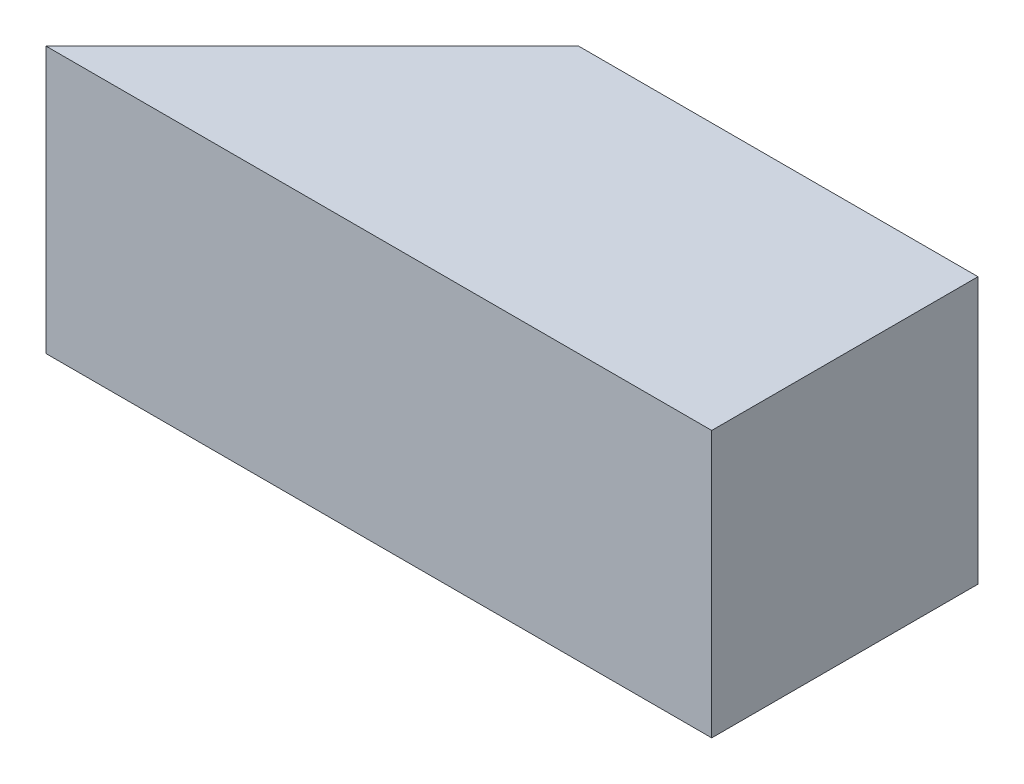
ISO-10303-21;
HEADER;
FILE_DESCRIPTION(('STEP AP214'),'2;1');
FILE_NAME('part.step','',(''),(''),'','','');
FILE_SCHEMA(('AUTOMOTIVE_DESIGN { 1 0 10303 214 1 1 1 1 }'));
ENDSEC;
DATA;
#1=APPLICATION_CONTEXT('core data for automotive mechanical design processes');
#2=APPLICATION_PROTOCOL_DEFINITION('international standard','automotive_design',2000,#1);
#3=PRODUCT_CONTEXT('',#1,'mechanical');
#4=PRODUCT('Part','Part','',(#3));
#5=PRODUCT_RELATED_PRODUCT_CATEGORY('part','',(#4));
#6=PRODUCT_DEFINITION_FORMATION('','',#4);
#7=PRODUCT_DEFINITION_CONTEXT('part definition',#1,'design');
#8=PRODUCT_DEFINITION('design','',#6,#7);
#9=PRODUCT_DEFINITION_SHAPE('','',#8);
#10=(LENGTH_UNIT() NAMED_UNIT(*) SI_UNIT(.MILLI.,.METRE.));
#11=(NAMED_UNIT(*) PLANE_ANGLE_UNIT() SI_UNIT($,.RADIAN.));
#12=(NAMED_UNIT(*) SI_UNIT($,.STERADIAN.) SOLID_ANGLE_UNIT());
#13=UNCERTAINTY_MEASURE_WITH_UNIT(LENGTH_MEASURE(1.E-05),#10,'distance_accuracy_value','');
#14=(GEOMETRIC_REPRESENTATION_CONTEXT(3) GLOBAL_UNCERTAINTY_ASSIGNED_CONTEXT((#13)) GLOBAL_UNIT_ASSIGNED_CONTEXT((#10,
#11,#12)) REPRESENTATION_CONTEXT('',''));
#15=CARTESIAN_POINT('',(0.,0.,0.));
#16=DIRECTION('',(0.,0.,1.));
#17=DIRECTION('',(1.,0.,0.));
#18=AXIS2_PLACEMENT_3D('',#15,#16,#17);
#19=CARTESIAN_POINT('',(-181.691506492826,40.,177.712147736125));
#20=DIRECTION('',(-1.,0.,0.));
#21=DIRECTION('',(0.,0.,1.));
#22=AXIS2_PLACEMENT_3D('',#19,#20,#21);
#23=PLANE('',#22);
#24=DIRECTION('',(0.,0.,-1.));
#25=VECTOR('',#24,1.);
#26=CARTESIAN_POINT('',(-181.691506492826,0.,177.712147736125));
#27=LINE('',#26,#25);
#28=CARTESIAN_POINT('',(-181.691506492826,0.,217.712147736125));
#29=VERTEX_POINT('',#28);
#30=CARTESIAN_POINT('',(-181.691506492826,0.,177.712147736125));
#31=VERTEX_POINT('',#30);
#32=EDGE_CURVE('E96',#29,#31,#27,.T.);
#33=ORIENTED_EDGE('',*,*,#32,.T.);
#34=DIRECTION('',(0.,-1.,0.));
#35=VECTOR('',#34,1.);
#36=CARTESIAN_POINT('',(-181.691506492826,40.,177.712147736125));
#37=LINE('',#36,#35);
#38=CARTESIAN_POINT('',(-181.691506492826,40.,177.712147736125));
#39=VERTEX_POINT('',#38);
#40=EDGE_CURVE('E11',#39,#31,#37,.T.);
#41=ORIENTED_EDGE('',*,*,#40,.F.);
#42=DIRECTION('',(0.,0.,-1.));
#43=VECTOR('',#42,1.);
#44=CARTESIAN_POINT('',(-181.691506492826,40.,177.712147736125));
#45=LINE('',#44,#43);
#46=CARTESIAN_POINT('',(-181.691506492826,40.,217.712147736125));
#47=VERTEX_POINT('',#46);
#48=EDGE_CURVE('E84',#47,#39,#45,.T.);
#49=ORIENTED_EDGE('',*,*,#48,.F.);
#50=DIRECTION('',(0.,-1.,0.));
#51=VECTOR('',#50,1.);
#52=CARTESIAN_POINT('',(-181.691506492826,40.,217.712147736125));
#53=LINE('',#52,#51);
#54=EDGE_CURVE('E92',#47,#29,#53,.T.);
#55=ORIENTED_EDGE('',*,*,#54,.T.);
#56=EDGE_LOOP('',(#33,#41,#49,#55));
#57=FACE_BOUND('',#56,.T.);
#58=ADVANCED_FACE('F33',(#57),#23,.F.);
#59=CARTESIAN_POINT('',(-241.691506492826,40.,177.712147736125));
#60=DIRECTION('',(0.,0.,1.));
#61=DIRECTION('',(1.,0.,0.));
#62=AXIS2_PLACEMENT_3D('',#59,#60,#61);
#63=PLANE('',#62);
#64=DIRECTION('',(-1.,0.,0.));
#65=VECTOR('',#64,1.);
#66=CARTESIAN_POINT('',(-241.691506492826,0.,177.712147736125));
#67=LINE('',#66,#65);
#68=CARTESIAN_POINT('',(-241.691506492826,0.,177.712147736125));
#69=VERTEX_POINT('',#68);
#70=EDGE_CURVE('E88',#31,#69,#67,.T.);
#71=ORIENTED_EDGE('',*,*,#70,.T.);
#72=DIRECTION('',(0.,-1.,0.));
#73=VECTOR('',#72,1.);
#74=CARTESIAN_POINT('',(-241.691506492826,40.,177.712147736125));
#75=LINE('',#74,#73);
#76=CARTESIAN_POINT('',(-241.691506492826,40.,177.712147736125));
#77=VERTEX_POINT('',#76);
#78=EDGE_CURVE('E41',#77,#69,#75,.T.);
#79=ORIENTED_EDGE('',*,*,#78,.F.);
#80=DIRECTION('',(-1.,0.,0.));
#81=VECTOR('',#80,1.);
#82=CARTESIAN_POINT('',(-241.691506492826,40.,177.712147736125));
#83=LINE('',#82,#81);
#84=EDGE_CURVE('E79',#39,#77,#83,.T.);
#85=ORIENTED_EDGE('',*,*,#84,.F.);
#86=ORIENTED_EDGE('',*,*,#40,.T.);
#87=EDGE_LOOP('',(#71,#79,#85,#86));
#88=FACE_BOUND('',#87,.T.);
#89=ADVANCED_FACE('F87',(#88),#63,.F.);
#90=CARTESIAN_POINT('',(-281.691506492826,40.,217.712147736125));
#91=DIRECTION('',(0.707106781186549,0.,0.707106781186546));
#92=DIRECTION('',(0.707106781186546,0.,-0.707106781186549));
#93=AXIS2_PLACEMENT_3D('',#90,#91,#92);
#94=PLANE('',#93);
#95=DIRECTION('',(-0.707106781186546,0.,0.707106781186549));
#96=VECTOR('',#95,1.);
#97=CARTESIAN_POINT('',(-281.691506492826,0.,217.712147736125));
#98=LINE('',#97,#96);
#99=CARTESIAN_POINT('',(-281.691506492826,0.,217.712147736125));
#100=VERTEX_POINT('',#99);
#101=EDGE_CURVE('E66',#69,#100,#98,.T.);
#102=ORIENTED_EDGE('',*,*,#101,.T.);
#103=DIRECTION('',(0.,-1.,0.));
#104=VECTOR('',#103,1.);
#105=CARTESIAN_POINT('',(-281.691506492826,40.,217.712147736125));
#106=LINE('',#105,#104);
#107=CARTESIAN_POINT('',(-281.691506492826,40.,217.712147736125));
#108=VERTEX_POINT('',#107);
#109=EDGE_CURVE('E89',#108,#100,#106,.T.);
#110=ORIENTED_EDGE('',*,*,#109,.F.);
#111=DIRECTION('',(-0.707106781186546,0.,0.707106781186549));
#112=VECTOR('',#111,1.);
#113=CARTESIAN_POINT('',(-281.691506492826,40.,217.712147736125));
#114=LINE('',#113,#112);
#115=EDGE_CURVE('E82',#77,#108,#114,.T.);
#116=ORIENTED_EDGE('',*,*,#115,.F.);
#117=ORIENTED_EDGE('',*,*,#78,.T.);
#118=EDGE_LOOP('',(#102,#110,#116,#117));
#119=FACE_BOUND('',#118,.T.);
#120=ADVANCED_FACE('F90',(#119),#94,.F.);
#121=CARTESIAN_POINT('',(-281.691506492826,40.,217.712147736125));
#122=DIRECTION('',(0.,0.,-1.));
#123=DIRECTION('',(-1.,0.,0.));
#124=AXIS2_PLACEMENT_3D('',#121,#122,#123);
#125=PLANE('',#124);
#126=DIRECTION('',(1.,0.,0.));
#127=VECTOR('',#126,1.);
#128=CARTESIAN_POINT('',(-281.691506492826,0.,217.712147736125));
#129=LINE('',#128,#127);
#130=EDGE_CURVE('E72',#100,#29,#129,.T.);
#131=ORIENTED_EDGE('',*,*,#130,.T.);
#132=ORIENTED_EDGE('',*,*,#54,.F.);
#133=DIRECTION('',(1.,0.,0.));
#134=VECTOR('',#133,1.);
#135=CARTESIAN_POINT('',(-281.691506492826,40.,217.712147736125));
#136=LINE('',#135,#134);
#137=EDGE_CURVE('E49',#108,#47,#136,.T.);
#138=ORIENTED_EDGE('',*,*,#137,.F.);
#139=ORIENTED_EDGE('',*,*,#109,.T.);
#140=EDGE_LOOP('',(#131,#132,#138,#139));
#141=FACE_BOUND('',#140,.T.);
#142=ADVANCED_FACE('F103',(#141),#125,.F.);
#143=CARTESIAN_POINT('',(0.,40.,0.));
#144=DIRECTION('',(0.,1.,0.));
#145=DIRECTION('',(0.,0.,1.));
#146=AXIS2_PLACEMENT_3D('',#143,#144,#145);
#147=PLANE('',#146);
#148=ORIENTED_EDGE('',*,*,#48,.T.);
#149=ORIENTED_EDGE('',*,*,#84,.T.);
#150=ORIENTED_EDGE('',*,*,#115,.T.);
#151=ORIENTED_EDGE('',*,*,#137,.T.);
#152=EDGE_LOOP('',(#148,#149,#150,#151));
#153=FACE_BOUND('',#152,.T.);
#154=ADVANCED_FACE('F80',(#153),#147,.T.);
#155=CARTESIAN_POINT('',(0.,0.,0.));
#156=DIRECTION('',(0.,1.,0.));
#157=DIRECTION('',(0.,0.,1.));
#158=AXIS2_PLACEMENT_3D('',#155,#156,#157);
#159=PLANE('',#158);
#160=ORIENTED_EDGE('',*,*,#32,.F.);
#161=ORIENTED_EDGE('',*,*,#130,.F.);
#162=ORIENTED_EDGE('',*,*,#101,.F.);
#163=ORIENTED_EDGE('',*,*,#70,.F.);
#164=EDGE_LOOP('',(#160,#161,#162,#163));
#165=FACE_BOUND('',#164,.T.);
#166=ADVANCED_FACE('F106',(#165),#159,.F.);
#167=CLOSED_SHELL('',(#58,#89,#120,#142,#154,#166));
#168=MANIFOLD_SOLID_BREP('B2',#167);
#169=ADVANCED_BREP_SHAPE_REPRESENTATION('',(#18,#168),#14);
#170=SHAPE_DEFINITION_REPRESENTATION(#9,#169);
ENDSEC;
END-ISO-10303-21;
